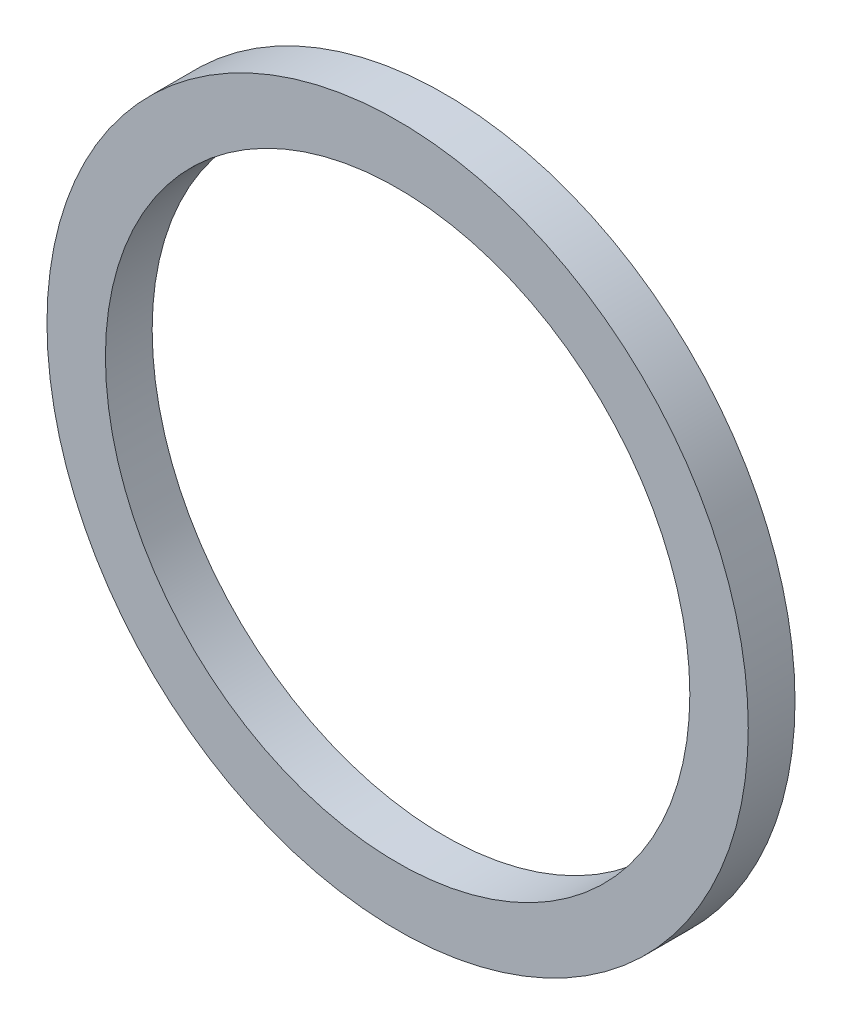
ISO-10303-21;
HEADER;
FILE_DESCRIPTION(('STEP AP214'),'2;1');
FILE_NAME('part.step','',(''),(''),'','','');
FILE_SCHEMA(('AUTOMOTIVE_DESIGN { 1 0 10303 214 1 1 1 1 }'));
ENDSEC;
DATA;
#1=APPLICATION_CONTEXT('core data for automotive mechanical design processes');
#2=APPLICATION_PROTOCOL_DEFINITION('international standard','automotive_design',2000,#1);
#3=PRODUCT_CONTEXT('',#1,'mechanical');
#4=PRODUCT('Part','Part','',(#3));
#5=PRODUCT_RELATED_PRODUCT_CATEGORY('part','',(#4));
#6=PRODUCT_DEFINITION_FORMATION('','',#4);
#7=PRODUCT_DEFINITION_CONTEXT('part definition',#1,'design');
#8=PRODUCT_DEFINITION('design','',#6,#7);
#9=PRODUCT_DEFINITION_SHAPE('','',#8);
#10=(LENGTH_UNIT() NAMED_UNIT(*) SI_UNIT(.MILLI.,.METRE.));
#11=(NAMED_UNIT(*) PLANE_ANGLE_UNIT() SI_UNIT($,.RADIAN.));
#12=(NAMED_UNIT(*) SI_UNIT($,.STERADIAN.) SOLID_ANGLE_UNIT());
#13=UNCERTAINTY_MEASURE_WITH_UNIT(LENGTH_MEASURE(1.E-05),#10,'distance_accuracy_value','');
#14=(GEOMETRIC_REPRESENTATION_CONTEXT(3) GLOBAL_UNCERTAINTY_ASSIGNED_CONTEXT((#13)) GLOBAL_UNIT_ASSIGNED_CONTEXT((#10,
#11,#12)) REPRESENTATION_CONTEXT('',''));
#15=CARTESIAN_POINT('',(0.,0.,0.));
#16=DIRECTION('',(0.,0.,1.));
#17=DIRECTION('',(1.,0.,0.));
#18=AXIS2_PLACEMENT_3D('',#15,#16,#17);
#19=CARTESIAN_POINT('',(0.,0.,2.));
#20=DIRECTION('',(0.,0.,1.));
#21=DIRECTION('',(1.,0.,0.));
#22=AXIS2_PLACEMENT_3D('',#19,#20,#21);
#23=PLANE('',#22);
#24=CARTESIAN_POINT('',(0.,0.,2.));
#25=DIRECTION('',(0.,0.,1.));
#26=DIRECTION('',(1.,0.,0.));
#27=AXIS2_PLACEMENT_3D('',#24,#25,#26);
#28=CIRCLE('',#27,15.);
#29=CARTESIAN_POINT('',(15.,0.,2.));
#30=VERTEX_POINT('',#29);
#31=EDGE_CURVE('E10',#30,#30,#28,.T.);
#32=ORIENTED_EDGE('',*,*,#31,.T.);
#33=EDGE_LOOP('',(#32));
#34=FACE_BOUND('',#33,.T.);
#35=CARTESIAN_POINT('',(0.,0.,2.));
#36=DIRECTION('',(0.,0.,1.));
#37=DIRECTION('',(1.,0.,0.));
#38=AXIS2_PLACEMENT_3D('',#35,#36,#37);
#39=CIRCLE('',#38,12.5);
#40=CARTESIAN_POINT('',(12.5,0.,2.));
#41=VERTEX_POINT('',#40);
#42=EDGE_CURVE('E48',#41,#41,#39,.T.);
#43=ORIENTED_EDGE('',*,*,#42,.F.);
#44=EDGE_LOOP('',(#43));
#45=FACE_BOUND('',#44,.T.);
#46=ADVANCED_FACE('F37',(#34,#45),#23,.T.);
#47=CARTESIAN_POINT('',(0.,0.,0.));
#48=DIRECTION('',(0.,0.,1.));
#49=DIRECTION('',(1.,0.,0.));
#50=AXIS2_PLACEMENT_3D('',#47,#48,#49);
#51=PLANE('',#50);
#52=CARTESIAN_POINT('',(0.,0.,0.));
#53=DIRECTION('',(0.,0.,1.));
#54=DIRECTION('',(1.,0.,0.));
#55=AXIS2_PLACEMENT_3D('',#52,#53,#54);
#56=CIRCLE('',#55,15.);
#57=CARTESIAN_POINT('',(15.,0.,0.));
#58=VERTEX_POINT('',#57);
#59=EDGE_CURVE('E41',#58,#58,#56,.T.);
#60=ORIENTED_EDGE('',*,*,#59,.F.);
#61=EDGE_LOOP('',(#60));
#62=FACE_BOUND('',#61,.T.);
#63=CARTESIAN_POINT('',(0.,0.,0.));
#64=DIRECTION('',(0.,0.,1.));
#65=DIRECTION('',(1.,0.,0.));
#66=AXIS2_PLACEMENT_3D('',#63,#64,#65);
#67=CIRCLE('',#66,12.5);
#68=CARTESIAN_POINT('',(12.5,0.,0.));
#69=VERTEX_POINT('',#68);
#70=EDGE_CURVE('E50',#69,#69,#67,.T.);
#71=ORIENTED_EDGE('',*,*,#70,.T.);
#72=EDGE_LOOP('',(#71));
#73=FACE_BOUND('',#72,.T.);
#74=ADVANCED_FACE('F60',(#62,#73),#51,.F.);
#75=CARTESIAN_POINT('',(0.,0.,2.));
#76=DIRECTION('',(0.,0.,-1.));
#77=DIRECTION('',(-1.,0.,0.));
#78=AXIS2_PLACEMENT_3D('',#75,#76,#77);
#79=CYLINDRICAL_SURFACE('',#78,15.);
#80=ORIENTED_EDGE('',*,*,#31,.F.);
#81=EDGE_LOOP('',(#80));
#82=FACE_BOUND('',#81,.T.);
#83=ORIENTED_EDGE('',*,*,#59,.T.);
#84=EDGE_LOOP('',(#83));
#85=FACE_BOUND('',#84,.T.);
#86=ADVANCED_FACE('F39',(#82,#85),#79,.T.);
#87=CARTESIAN_POINT('',(0.,0.,2.));
#88=DIRECTION('',(0.,0.,-1.));
#89=DIRECTION('',(-1.,0.,0.));
#90=AXIS2_PLACEMENT_3D('',#87,#88,#89);
#91=CYLINDRICAL_SURFACE('',#90,12.5);
#92=ORIENTED_EDGE('',*,*,#42,.T.);
#93=EDGE_LOOP('',(#92));
#94=FACE_BOUND('',#93,.T.);
#95=ORIENTED_EDGE('',*,*,#70,.F.);
#96=EDGE_LOOP('',(#95));
#97=FACE_BOUND('',#96,.T.);
#98=ADVANCED_FACE('F56',(#94,#97),#91,.F.);
#99=CLOSED_SHELL('',(#46,#74,#86,#98));
#100=MANIFOLD_SOLID_BREP('B2',#99);
#101=ADVANCED_BREP_SHAPE_REPRESENTATION('',(#18,#100),#14);
#102=SHAPE_DEFINITION_REPRESENTATION(#9,#101);
ENDSEC;
END-ISO-10303-21;
